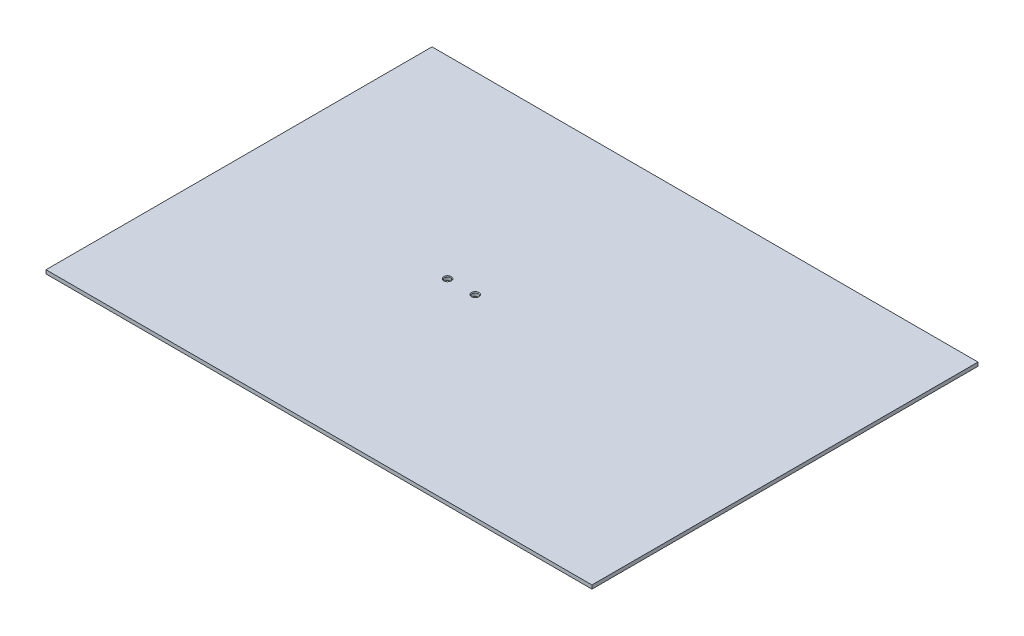
ISO-10303-21;
HEADER;
FILE_DESCRIPTION(('STEP AP214'),'2;1');
FILE_NAME('part.step','',(''),(''),'','','');
FILE_SCHEMA(('AUTOMOTIVE_DESIGN { 1 0 10303 214 1 1 1 1 }'));
ENDSEC;
DATA;
#1=APPLICATION_CONTEXT('core data for automotive mechanical design processes');
#2=APPLICATION_PROTOCOL_DEFINITION('international standard','automotive_design',2000,#1);
#3=PRODUCT_CONTEXT('',#1,'mechanical');
#4=PRODUCT('Part','Part','',(#3));
#5=PRODUCT_RELATED_PRODUCT_CATEGORY('part','',(#4));
#6=PRODUCT_DEFINITION_FORMATION('','',#4);
#7=PRODUCT_DEFINITION_CONTEXT('part definition',#1,'design');
#8=PRODUCT_DEFINITION('design','',#6,#7);
#9=PRODUCT_DEFINITION_SHAPE('','',#8);
#10=(LENGTH_UNIT() NAMED_UNIT(*) SI_UNIT(.MILLI.,.METRE.));
#11=(NAMED_UNIT(*) PLANE_ANGLE_UNIT() SI_UNIT($,.RADIAN.));
#12=(NAMED_UNIT(*) SI_UNIT($,.STERADIAN.) SOLID_ANGLE_UNIT());
#13=UNCERTAINTY_MEASURE_WITH_UNIT(LENGTH_MEASURE(1.E-05),#10,'distance_accuracy_value','');
#14=(GEOMETRIC_REPRESENTATION_CONTEXT(3) GLOBAL_UNCERTAINTY_ASSIGNED_CONTEXT((#13)) GLOBAL_UNIT_ASSIGNED_CONTEXT((#10,
#11,#12)) REPRESENTATION_CONTEXT('',''));
#15=CARTESIAN_POINT('',(0.,0.,0.));
#16=DIRECTION('',(0.,0.,1.));
#17=DIRECTION('',(1.,0.,0.));
#18=AXIS2_PLACEMENT_3D('',#15,#16,#17);
#19=CARTESIAN_POINT('',(148.5,2.,105.));
#20=DIRECTION('',(-1.,0.,0.));
#21=DIRECTION('',(0.,0.,1.));
#22=AXIS2_PLACEMENT_3D('',#19,#20,#21);
#23=PLANE('',#22);
#24=DIRECTION('',(0.,0.,-1.));
#25=VECTOR('',#24,1.);
#26=CARTESIAN_POINT('',(148.5,0.,105.));
#27=LINE('',#26,#25);
#28=CARTESIAN_POINT('',(148.5,0.,105.));
#29=VERTEX_POINT('',#28);
#30=CARTESIAN_POINT('',(148.5,0.,-105.));
#31=VERTEX_POINT('',#30);
#32=EDGE_CURVE('E114',#29,#31,#27,.T.);
#33=ORIENTED_EDGE('',*,*,#32,.T.);
#34=DIRECTION('',(0.,-1.,0.));
#35=VECTOR('',#34,1.);
#36=CARTESIAN_POINT('',(148.5,2.,-105.));
#37=LINE('',#36,#35);
#38=CARTESIAN_POINT('',(148.5,2.,-105.));
#39=VERTEX_POINT('',#38);
#40=EDGE_CURVE('E11',#39,#31,#37,.T.);
#41=ORIENTED_EDGE('',*,*,#40,.F.);
#42=DIRECTION('',(0.,0.,-1.));
#43=VECTOR('',#42,1.);
#44=CARTESIAN_POINT('',(148.5,2.,105.));
#45=LINE('',#44,#43);
#46=CARTESIAN_POINT('',(148.5,2.,105.));
#47=VERTEX_POINT('',#46);
#48=EDGE_CURVE('E102',#47,#39,#45,.T.);
#49=ORIENTED_EDGE('',*,*,#48,.F.);
#50=DIRECTION('',(0.,-1.,0.));
#51=VECTOR('',#50,1.);
#52=CARTESIAN_POINT('',(148.5,2.,105.));
#53=LINE('',#52,#51);
#54=EDGE_CURVE('E110',#47,#29,#53,.T.);
#55=ORIENTED_EDGE('',*,*,#54,.T.);
#56=EDGE_LOOP('',(#33,#41,#49,#55));
#57=FACE_BOUND('',#56,.T.);
#58=ADVANCED_FACE('F51',(#57),#23,.F.);
#59=CARTESIAN_POINT('',(-148.5,2.,-105.));
#60=DIRECTION('',(0.,0.,1.));
#61=DIRECTION('',(1.,0.,0.));
#62=AXIS2_PLACEMENT_3D('',#59,#60,#61);
#63=PLANE('',#62);
#64=DIRECTION('',(-1.,0.,0.));
#65=VECTOR('',#64,1.);
#66=CARTESIAN_POINT('',(-148.5,0.,-105.));
#67=LINE('',#66,#65);
#68=CARTESIAN_POINT('',(-148.5,0.,-105.));
#69=VERTEX_POINT('',#68);
#70=EDGE_CURVE('E106',#31,#69,#67,.T.);
#71=ORIENTED_EDGE('',*,*,#70,.T.);
#72=DIRECTION('',(0.,-1.,0.));
#73=VECTOR('',#72,1.);
#74=CARTESIAN_POINT('',(-148.5,2.,-105.));
#75=LINE('',#74,#73);
#76=CARTESIAN_POINT('',(-148.5,2.,-105.));
#77=VERTEX_POINT('',#76);
#78=EDGE_CURVE('E59',#77,#69,#75,.T.);
#79=ORIENTED_EDGE('',*,*,#78,.F.);
#80=DIRECTION('',(-1.,0.,0.));
#81=VECTOR('',#80,1.);
#82=CARTESIAN_POINT('',(-148.5,2.,-105.));
#83=LINE('',#82,#81);
#84=EDGE_CURVE('E97',#39,#77,#83,.T.);
#85=ORIENTED_EDGE('',*,*,#84,.F.);
#86=ORIENTED_EDGE('',*,*,#40,.T.);
#87=EDGE_LOOP('',(#71,#79,#85,#86));
#88=FACE_BOUND('',#87,.T.);
#89=ADVANCED_FACE('F105',(#88),#63,.F.);
#90=CARTESIAN_POINT('',(-148.5,2.,105.));
#91=DIRECTION('',(1.,0.,0.));
#92=DIRECTION('',(0.,0.,-1.));
#93=AXIS2_PLACEMENT_3D('',#90,#91,#92);
#94=PLANE('',#93);
#95=DIRECTION('',(0.,0.,1.));
#96=VECTOR('',#95,1.);
#97=CARTESIAN_POINT('',(-148.5,0.,105.));
#98=LINE('',#97,#96);
#99=CARTESIAN_POINT('',(-148.5,0.,105.));
#100=VERTEX_POINT('',#99);
#101=EDGE_CURVE('E84',#69,#100,#98,.T.);
#102=ORIENTED_EDGE('',*,*,#101,.T.);
#103=DIRECTION('',(0.,-1.,0.));
#104=VECTOR('',#103,1.);
#105=CARTESIAN_POINT('',(-148.5,2.,105.));
#106=LINE('',#105,#104);
#107=CARTESIAN_POINT('',(-148.5,2.,105.));
#108=VERTEX_POINT('',#107);
#109=EDGE_CURVE('E107',#108,#100,#106,.T.);
#110=ORIENTED_EDGE('',*,*,#109,.F.);
#111=DIRECTION('',(0.,0.,1.));
#112=VECTOR('',#111,1.);
#113=CARTESIAN_POINT('',(-148.5,2.,105.));
#114=LINE('',#113,#112);
#115=EDGE_CURVE('E100',#77,#108,#114,.T.);
#116=ORIENTED_EDGE('',*,*,#115,.F.);
#117=ORIENTED_EDGE('',*,*,#78,.T.);
#118=EDGE_LOOP('',(#102,#110,#116,#117));
#119=FACE_BOUND('',#118,.T.);
#120=ADVANCED_FACE('F108',(#119),#94,.F.);
#121=CARTESIAN_POINT('',(-148.5,2.,105.));
#122=DIRECTION('',(0.,0.,-1.));
#123=DIRECTION('',(-1.,0.,0.));
#124=AXIS2_PLACEMENT_3D('',#121,#122,#123);
#125=PLANE('',#124);
#126=DIRECTION('',(1.,0.,0.));
#127=VECTOR('',#126,1.);
#128=CARTESIAN_POINT('',(-148.5,0.,105.));
#129=LINE('',#128,#127);
#130=EDGE_CURVE('E90',#100,#29,#129,.T.);
#131=ORIENTED_EDGE('',*,*,#130,.T.);
#132=ORIENTED_EDGE('',*,*,#54,.F.);
#133=DIRECTION('',(1.,0.,0.));
#134=VECTOR('',#133,1.);
#135=CARTESIAN_POINT('',(-148.5,2.,105.));
#136=LINE('',#135,#134);
#137=EDGE_CURVE('E67',#108,#47,#136,.T.);
#138=ORIENTED_EDGE('',*,*,#137,.F.);
#139=ORIENTED_EDGE('',*,*,#109,.T.);
#140=EDGE_LOOP('',(#131,#132,#138,#139));
#141=FACE_BOUND('',#140,.T.);
#142=ADVANCED_FACE('F122',(#141),#125,.F.);
#143=CARTESIAN_POINT('',(0.,2.,0.));
#144=DIRECTION('',(0.,-1.,0.));
#145=DIRECTION('',(0.,0.,-1.));
#146=AXIS2_PLACEMENT_3D('',#143,#144,#145);
#147=PLANE('',#146);
#148=CARTESIAN_POINT('',(-20.,2.,0.));
#149=DIRECTION('',(0.,1.,0.));
#150=DIRECTION('',(0.,0.,1.));
#151=AXIS2_PLACEMENT_3D('',#148,#149,#150);
#152=CIRCLE('',#151,2.025);
#153=CARTESIAN_POINT('',(-20.,2.,2.025));
#154=VERTEX_POINT('',#153);
#155=EDGE_CURVE('E142',#154,#154,#152,.T.);
#156=ORIENTED_EDGE('',*,*,#155,.F.);
#157=EDGE_LOOP('',(#156));
#158=FACE_BOUND('',#157,.T.);
#159=CARTESIAN_POINT('',(-35.,2.,0.));
#160=DIRECTION('',(0.,1.,0.));
#161=DIRECTION('',(0.,0.,1.));
#162=AXIS2_PLACEMENT_3D('',#159,#160,#161);
#163=CIRCLE('',#162,2.025);
#164=CARTESIAN_POINT('',(-35.,2.,2.025));
#165=VERTEX_POINT('',#164);
#166=EDGE_CURVE('E133',#165,#165,#163,.T.);
#167=ORIENTED_EDGE('',*,*,#166,.F.);
#168=EDGE_LOOP('',(#167));
#169=FACE_BOUND('',#168,.T.);
#170=ORIENTED_EDGE('',*,*,#48,.T.);
#171=ORIENTED_EDGE('',*,*,#84,.T.);
#172=ORIENTED_EDGE('',*,*,#115,.T.);
#173=ORIENTED_EDGE('',*,*,#137,.T.);
#174=EDGE_LOOP('',(#170,#171,#172,#173));
#175=FACE_BOUND('',#174,.T.);
#176=ADVANCED_FACE('F98',(#158,#169,#175),#147,.F.);
#177=CARTESIAN_POINT('',(0.,0.,0.));
#178=DIRECTION('',(0.,-1.,0.));
#179=DIRECTION('',(0.,0.,-1.));
#180=AXIS2_PLACEMENT_3D('',#177,#178,#179);
#181=PLANE('',#180);
#182=CARTESIAN_POINT('',(-20.,0.,0.));
#183=DIRECTION('',(0.,1.,0.));
#184=DIRECTION('',(0.,0.,1.));
#185=AXIS2_PLACEMENT_3D('',#182,#183,#184);
#186=CIRCLE('',#185,1.65);
#187=CARTESIAN_POINT('',(-20.,0.,1.65));
#188=VERTEX_POINT('',#187);
#189=EDGE_CURVE('E136',#188,#188,#186,.T.);
#190=ORIENTED_EDGE('',*,*,#189,.T.);
#191=EDGE_LOOP('',(#190));
#192=FACE_BOUND('',#191,.T.);
#193=CARTESIAN_POINT('',(-35.,0.,0.));
#194=DIRECTION('',(0.,1.,0.));
#195=DIRECTION('',(0.,0.,1.));
#196=AXIS2_PLACEMENT_3D('',#193,#194,#195);
#197=CIRCLE('',#196,1.65);
#198=CARTESIAN_POINT('',(-35.,0.,1.65));
#199=VERTEX_POINT('',#198);
#200=EDGE_CURVE('E117',#199,#199,#197,.T.);
#201=ORIENTED_EDGE('',*,*,#200,.T.);
#202=EDGE_LOOP('',(#201));
#203=FACE_BOUND('',#202,.T.);
#204=ORIENTED_EDGE('',*,*,#32,.F.);
#205=ORIENTED_EDGE('',*,*,#130,.F.);
#206=ORIENTED_EDGE('',*,*,#101,.F.);
#207=ORIENTED_EDGE('',*,*,#70,.F.);
#208=EDGE_LOOP('',(#204,#205,#206,#207));
#209=FACE_BOUND('',#208,.T.);
#210=ADVANCED_FACE('F125',(#192,#203,#209),#181,.T.);
#211=CARTESIAN_POINT('',(-35.,2.,0.));
#212=DIRECTION('',(0.,1.,0.));
#213=DIRECTION('',(0.,0.,1.));
#214=AXIS2_PLACEMENT_3D('',#211,#212,#213);
#215=CYLINDRICAL_SURFACE('',#214,1.65);
#216=ORIENTED_EDGE('',*,*,#200,.F.);
#217=EDGE_LOOP('',(#216));
#218=FACE_BOUND('',#217,.T.);
#219=CARTESIAN_POINT('',(-35.,1.625,0.));
#220=DIRECTION('',(0.,1.,0.));
#221=DIRECTION('',(0.,0.,1.));
#222=AXIS2_PLACEMENT_3D('',#219,#220,#221);
#223=CIRCLE('',#222,1.65);
#224=CARTESIAN_POINT('',(-35.,1.625,1.65));
#225=VERTEX_POINT('',#224);
#226=EDGE_CURVE('E130',#225,#225,#223,.T.);
#227=ORIENTED_EDGE('',*,*,#226,.T.);
#228=EDGE_LOOP('',(#227));
#229=FACE_BOUND('',#228,.T.);
#230=ADVANCED_FACE('F156',(#218,#229),#215,.F.);
#231=CARTESIAN_POINT('',(-35.,2.,0.));
#232=DIRECTION('',(0.,1.,0.));
#233=DIRECTION('',(0.,0.,1.));
#234=AXIS2_PLACEMENT_3D('',#231,#232,#233);
#235=CONICAL_SURFACE('',#234,2.025,0.785398163397447);
#236=ORIENTED_EDGE('',*,*,#226,.F.);
#237=EDGE_LOOP('',(#236));
#238=FACE_BOUND('',#237,.T.);
#239=ORIENTED_EDGE('',*,*,#166,.T.);
#240=EDGE_LOOP('',(#239));
#241=FACE_BOUND('',#240,.T.);
#242=ADVANCED_FACE('F153',(#238,#241),#235,.F.);
#243=CARTESIAN_POINT('',(-20.,2.,0.));
#244=DIRECTION('',(0.,1.,0.));
#245=DIRECTION('',(0.,0.,1.));
#246=AXIS2_PLACEMENT_3D('',#243,#244,#245);
#247=CYLINDRICAL_SURFACE('',#246,1.65);
#248=ORIENTED_EDGE('',*,*,#189,.F.);
#249=EDGE_LOOP('',(#248));
#250=FACE_BOUND('',#249,.T.);
#251=CARTESIAN_POINT('',(-20.,1.625,0.));
#252=DIRECTION('',(0.,1.,0.));
#253=DIRECTION('',(0.,0.,1.));
#254=AXIS2_PLACEMENT_3D('',#251,#252,#253);
#255=CIRCLE('',#254,1.65);
#256=CARTESIAN_POINT('',(-20.,1.625,1.65));
#257=VERTEX_POINT('',#256);
#258=EDGE_CURVE('E139',#257,#257,#255,.T.);
#259=ORIENTED_EDGE('',*,*,#258,.T.);
#260=EDGE_LOOP('',(#259));
#261=FACE_BOUND('',#260,.T.);
#262=ADVANCED_FACE('F155',(#250,#261),#247,.F.);
#263=CARTESIAN_POINT('',(-20.,2.,0.));
#264=DIRECTION('',(0.,1.,0.));
#265=DIRECTION('',(0.,0.,1.));
#266=AXIS2_PLACEMENT_3D('',#263,#264,#265);
#267=CONICAL_SURFACE('',#266,2.025,0.785398163397447);
#268=ORIENTED_EDGE('',*,*,#258,.F.);
#269=EDGE_LOOP('',(#268));
#270=FACE_BOUND('',#269,.T.);
#271=ORIENTED_EDGE('',*,*,#155,.T.);
#272=EDGE_LOOP('',(#271));
#273=FACE_BOUND('',#272,.T.);
#274=ADVANCED_FACE('F146',(#270,#273),#267,.F.);
#275=CLOSED_SHELL('',(#58,#89,#120,#142,#176,#210,#230,#242,#262,#274));
#276=MANIFOLD_SOLID_BREP('B2',#275);
#277=ADVANCED_BREP_SHAPE_REPRESENTATION('',(#18,#276),#14);
#278=SHAPE_DEFINITION_REPRESENTATION(#9,#277);
ENDSEC;
END-ISO-10303-21;
